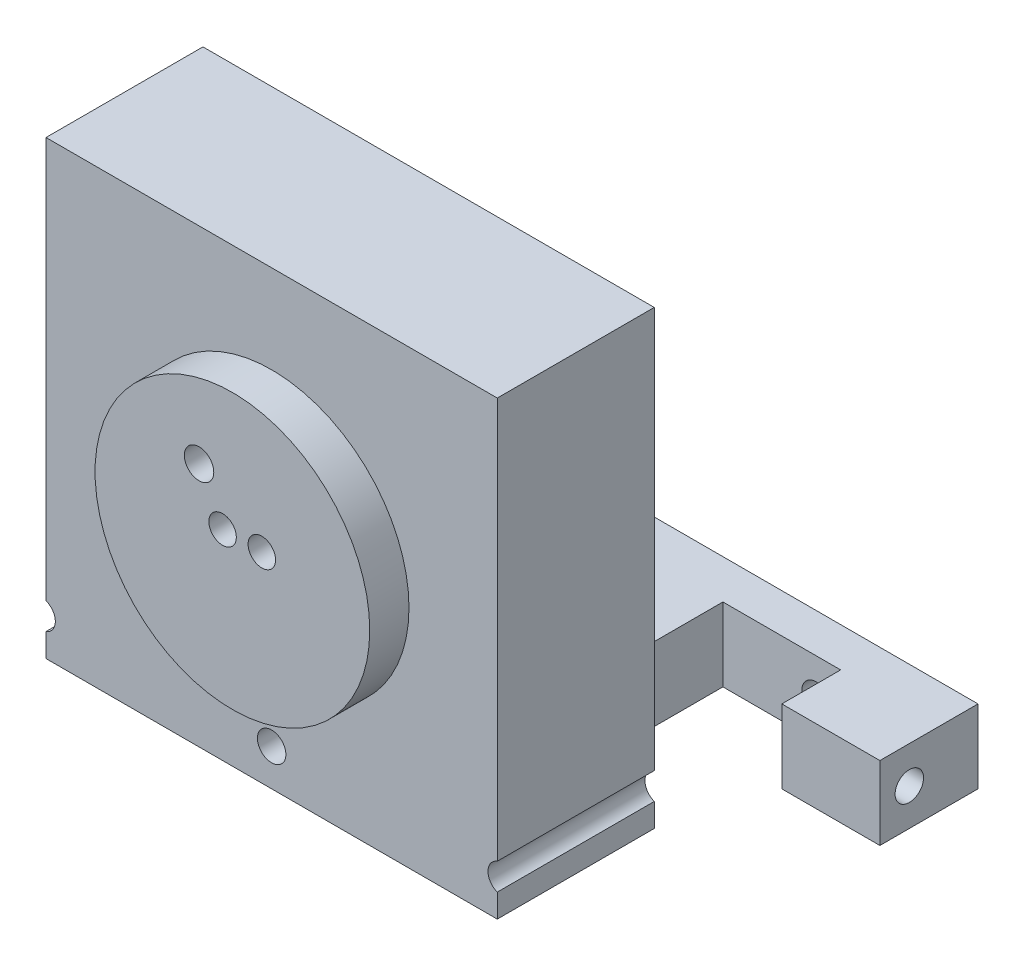
ISO-10303-21;
HEADER;
FILE_DESCRIPTION(('STEP AP214'),'2;1');
FILE_NAME('part.step','',(''),(''),'','','');
FILE_SCHEMA(('AUTOMOTIVE_DESIGN { 1 0 10303 214 1 1 1 1 }'));
ENDSEC;
DATA;
#1=APPLICATION_CONTEXT('core data for automotive mechanical design processes');
#2=APPLICATION_PROTOCOL_DEFINITION('international standard','automotive_design',2000,#1);
#3=PRODUCT_CONTEXT('',#1,'mechanical');
#4=PRODUCT('Part','Part','',(#3));
#5=PRODUCT_RELATED_PRODUCT_CATEGORY('part','',(#4));
#6=PRODUCT_DEFINITION_FORMATION('','',#4);
#7=PRODUCT_DEFINITION_CONTEXT('part definition',#1,'design');
#8=PRODUCT_DEFINITION('design','',#6,#7);
#9=PRODUCT_DEFINITION_SHAPE('','',#8);
#10=(LENGTH_UNIT() NAMED_UNIT(*) SI_UNIT(.MILLI.,.METRE.));
#11=(NAMED_UNIT(*) PLANE_ANGLE_UNIT() SI_UNIT($,.RADIAN.));
#12=(NAMED_UNIT(*) SI_UNIT($,.STERADIAN.) SOLID_ANGLE_UNIT());
#13=UNCERTAINTY_MEASURE_WITH_UNIT(LENGTH_MEASURE(1.E-05),#10,'distance_accuracy_value','');
#14=(GEOMETRIC_REPRESENTATION_CONTEXT(3) GLOBAL_UNCERTAINTY_ASSIGNED_CONTEXT((#13)) GLOBAL_UNIT_ASSIGNED_CONTEXT((#10,
#11,#12)) REPRESENTATION_CONTEXT('',''));
#15=CARTESIAN_POINT('',(0.,0.,0.));
#16=DIRECTION('',(0.,0.,1.));
#17=DIRECTION('',(1.,0.,0.));
#18=AXIS2_PLACEMENT_3D('',#15,#16,#17);
#19=CARTESIAN_POINT('',(11.5,0.,8.));
#20=DIRECTION('',(1.,0.,0.));
#21=DIRECTION('',(0.,0.,-1.));
#22=AXIS2_PLACEMENT_3D('',#19,#20,#21);
#23=PLANE('',#22);
#24=DIRECTION('',(0.,0.,-1.));
#25=VECTOR('',#24,1.);
#26=CARTESIAN_POINT('',(11.5,-10.3055328794408,10.050609665441));
#27=LINE('',#26,#25);
#28=CARTESIAN_POINT('',(11.5,-10.3055328794408,8.));
#29=VERTEX_POINT('',#28);
#30=CARTESIAN_POINT('',(11.5,-10.3055328794408,0.));
#31=VERTEX_POINT('',#30);
#32=EDGE_CURVE('E265',#29,#31,#27,.T.);
#33=ORIENTED_EDGE('',*,*,#32,.F.);
#34=DIRECTION('',(0.,-1.,0.));
#35=VECTOR('',#34,1.);
#36=CARTESIAN_POINT('',(11.5,0.,8.));
#37=LINE('',#36,#35);
#38=CARTESIAN_POINT('',(11.5,-11.5,8.));
#39=VERTEX_POINT('',#38);
#40=EDGE_CURVE('E322',#29,#39,#37,.T.);
#41=ORIENTED_EDGE('',*,*,#40,.T.);
#42=DIRECTION('',(0.,0.,-1.));
#43=VECTOR('',#42,1.);
#44=CARTESIAN_POINT('',(11.5,-11.5,8.));
#45=LINE('',#44,#43);
#46=CARTESIAN_POINT('',(11.5,-11.5,0.));
#47=VERTEX_POINT('',#46);
#48=EDGE_CURVE('E332',#39,#47,#45,.T.);
#49=ORIENTED_EDGE('',*,*,#48,.T.);
#50=DIRECTION('',(0.,-1.,0.));
#51=VECTOR('',#50,1.);
#52=CARTESIAN_POINT('',(11.5,0.,0.));
#53=LINE('',#52,#51);
#54=EDGE_CURVE('E335',#31,#47,#53,.T.);
#55=ORIENTED_EDGE('',*,*,#54,.F.);
#56=EDGE_LOOP('',(#33,#41,#49,#55));
#57=FACE_BOUND('',#56,.T.);
#58=ADVANCED_FACE('F35',(#57),#23,.T.);
#59=CARTESIAN_POINT('',(-11.5,0.,8.));
#60=DIRECTION('',(-1.,0.,0.));
#61=DIRECTION('',(0.,-1.,0.));
#62=AXIS2_PLACEMENT_3D('',#59,#60,#61);
#63=PLANE('',#62);
#64=DIRECTION('',(0.,0.,-1.));
#65=VECTOR('',#64,1.);
#66=CARTESIAN_POINT('',(-11.5,-8.94446712055919,10.050609665441));
#67=LINE('',#66,#65);
#68=CARTESIAN_POINT('',(-11.5,-8.94446712055919,8.));
#69=VERTEX_POINT('',#68);
#70=CARTESIAN_POINT('',(-11.5,-8.94446712055919,0.));
#71=VERTEX_POINT('',#70);
#72=EDGE_CURVE('E274',#69,#71,#67,.T.);
#73=ORIENTED_EDGE('',*,*,#72,.F.);
#74=DIRECTION('',(0.,1.,0.));
#75=VECTOR('',#74,1.);
#76=CARTESIAN_POINT('',(-11.5,0.,8.));
#77=LINE('',#76,#75);
#78=CARTESIAN_POINT('',(-11.5,11.5,8.));
#79=VERTEX_POINT('',#78);
#80=EDGE_CURVE('E325',#69,#79,#77,.T.);
#81=ORIENTED_EDGE('',*,*,#80,.T.);
#82=DIRECTION('',(0.,0.,-1.));
#83=VECTOR('',#82,1.);
#84=CARTESIAN_POINT('',(-11.5,11.5,8.));
#85=LINE('',#84,#83);
#86=CARTESIAN_POINT('',(-11.5,11.5,0.));
#87=VERTEX_POINT('',#86);
#88=EDGE_CURVE('E44',#79,#87,#85,.T.);
#89=ORIENTED_EDGE('',*,*,#88,.T.);
#90=DIRECTION('',(0.,1.,0.));
#91=VECTOR('',#90,1.);
#92=CARTESIAN_POINT('',(-11.5,0.,0.));
#93=LINE('',#92,#91);
#94=EDGE_CURVE('E342',#71,#87,#93,.T.);
#95=ORIENTED_EDGE('',*,*,#94,.F.);
#96=EDGE_LOOP('',(#73,#81,#89,#95));
#97=FACE_BOUND('',#96,.T.);
#98=ADVANCED_FACE('F359',(#97),#63,.T.);
#99=CARTESIAN_POINT('',(0.,0.,0.));
#100=DIRECTION('',(0.,0.,1.));
#101=DIRECTION('',(1.,0.,0.));
#102=AXIS2_PLACEMENT_3D('',#99,#100,#101);
#103=PLANE('',#102);
#104=CARTESIAN_POINT('',(0.,0.,0.));
#105=DIRECTION('',(0.,0.,1.));
#106=DIRECTION('',(1.,0.,0.));
#107=AXIS2_PLACEMENT_3D('',#104,#105,#106);
#108=CIRCLE('',#107,6.5);
#109=CARTESIAN_POINT('',(6.5,0.,0.));
#110=VERTEX_POINT('',#109);
#111=EDGE_CURVE('E317',#110,#110,#108,.T.);
#112=ORIENTED_EDGE('',*,*,#111,.T.);
#113=EDGE_LOOP('',(#112));
#114=FACE_BOUND('',#113,.T.);
#115=CARTESIAN_POINT('',(11.5,11.5,0.));
#116=VERTEX_POINT('',#115);
#117=CARTESIAN_POINT('',(11.5,-8.94446712055919,0.));
#118=VERTEX_POINT('',#117);
#119=EDGE_CURVE('E336',#116,#118,#53,.T.);
#120=ORIENTED_EDGE('',*,*,#119,.T.);
#121=CARTESIAN_POINT('',(11.75,-9.625,0.));
#122=DIRECTION('',(0.,0.,1.));
#123=DIRECTION('',(1.,0.,0.));
#124=AXIS2_PLACEMENT_3D('',#121,#122,#123);
#125=CIRCLE('',#124,0.725);
#126=EDGE_CURVE('E262',#118,#31,#125,.T.);
#127=ORIENTED_EDGE('',*,*,#126,.T.);
#128=ORIENTED_EDGE('',*,*,#54,.T.);
#129=DIRECTION('',(1.,0.,0.));
#130=VECTOR('',#129,1.);
#131=CARTESIAN_POINT('',(0.,-11.5,0.));
#132=LINE('',#131,#130);
#133=CARTESIAN_POINT('',(7.,-11.5,0.));
#134=VERTEX_POINT('',#133);
#135=EDGE_CURVE('E346',#134,#47,#132,.T.);
#136=ORIENTED_EDGE('',*,*,#135,.F.);
#137=DIRECTION('',(0.,-1.,0.));
#138=VECTOR('',#137,1.);
#139=CARTESIAN_POINT('',(7.,-11.5,0.));
#140=LINE('',#139,#138);
#141=CARTESIAN_POINT('',(7.,-7.75,0.));
#142=VERTEX_POINT('',#141);
#143=EDGE_CURVE('E295',#142,#134,#140,.T.);
#144=ORIENTED_EDGE('',*,*,#143,.F.);
#145=DIRECTION('',(1.,0.,0.));
#146=VECTOR('',#145,1.);
#147=CARTESIAN_POINT('',(0.,-7.75,0.));
#148=LINE('',#147,#146);
#149=CARTESIAN_POINT('',(-7.,-7.75,0.));
#150=VERTEX_POINT('',#149);
#151=EDGE_CURVE('E301',#150,#142,#148,.T.);
#152=ORIENTED_EDGE('',*,*,#151,.F.);
#153=DIRECTION('',(0.,1.,0.));
#154=VECTOR('',#153,1.);
#155=CARTESIAN_POINT('',(-7.,-11.5,0.));
#156=LINE('',#155,#154);
#157=CARTESIAN_POINT('',(-7.,-11.5,0.));
#158=VERTEX_POINT('',#157);
#159=EDGE_CURVE('E182',#158,#150,#156,.T.);
#160=ORIENTED_EDGE('',*,*,#159,.F.);
#161=CARTESIAN_POINT('',(-11.5,-11.5,0.));
#162=VERTEX_POINT('',#161);
#163=EDGE_CURVE('E347',#162,#158,#132,.T.);
#164=ORIENTED_EDGE('',*,*,#163,.F.);
#165=CARTESIAN_POINT('',(-11.5,-10.3055328794408,0.));
#166=VERTEX_POINT('',#165);
#167=EDGE_CURVE('E343',#162,#166,#93,.T.);
#168=ORIENTED_EDGE('',*,*,#167,.T.);
#169=CARTESIAN_POINT('',(-11.75,-9.625,0.));
#170=DIRECTION('',(0.,0.,1.));
#171=DIRECTION('',(1.,0.,0.));
#172=AXIS2_PLACEMENT_3D('',#169,#170,#171);
#173=CIRCLE('',#172,0.725);
#174=EDGE_CURVE('E271',#166,#71,#173,.T.);
#175=ORIENTED_EDGE('',*,*,#174,.T.);
#176=ORIENTED_EDGE('',*,*,#94,.T.);
#177=DIRECTION('',(1.,0.,0.));
#178=VECTOR('',#177,1.);
#179=CARTESIAN_POINT('',(0.,11.5,0.));
#180=LINE('',#179,#178);
#181=EDGE_CURVE('E339',#87,#116,#180,.T.);
#182=ORIENTED_EDGE('',*,*,#181,.T.);
#183=EDGE_LOOP('',(#120,#127,#128,#136,#144,#152,#160,#164,#168,#175,#176,#182));
#184=FACE_BOUND('',#183,.T.);
#185=ADVANCED_FACE('F366',(#114,#184),#103,.F.);
#186=DIRECTION('',(0.,0.,-1.));
#187=VECTOR('',#186,1.);
#188=CARTESIAN_POINT('',(11.5,-8.94446712055919,10.050609665441));
#189=LINE('',#188,#187);
#190=CARTESIAN_POINT('',(11.5,-8.94446712055919,8.));
#191=VERTEX_POINT('',#190);
#192=EDGE_CURVE('E59',#118,#191,#189,.F.);
#193=ORIENTED_EDGE('',*,*,#192,.F.);
#194=ORIENTED_EDGE('',*,*,#119,.F.);
#195=DIRECTION('',(0.,0.,-1.));
#196=VECTOR('',#195,1.);
#197=CARTESIAN_POINT('',(11.5,11.5,8.));
#198=LINE('',#197,#196);
#199=CARTESIAN_POINT('',(11.5,11.5,8.));
#200=VERTEX_POINT('',#199);
#201=EDGE_CURVE('E11',#200,#116,#198,.T.);
#202=ORIENTED_EDGE('',*,*,#201,.F.);
#203=EDGE_CURVE('E318',#200,#191,#37,.T.);
#204=ORIENTED_EDGE('',*,*,#203,.T.);
#205=EDGE_LOOP('',(#193,#194,#202,#204));
#206=FACE_BOUND('',#205,.T.);
#207=ADVANCED_FACE('F381',(#206),#23,.T.);
#208=CARTESIAN_POINT('',(0.,11.5,8.));
#209=DIRECTION('',(0.,1.,0.));
#210=DIRECTION('',(0.,0.,1.));
#211=AXIS2_PLACEMENT_3D('',#208,#209,#210);
#212=PLANE('',#211);
#213=ORIENTED_EDGE('',*,*,#181,.F.);
#214=ORIENTED_EDGE('',*,*,#88,.F.);
#215=DIRECTION('',(1.,0.,0.));
#216=VECTOR('',#215,1.);
#217=CARTESIAN_POINT('',(0.,11.5,8.));
#218=LINE('',#217,#216);
#219=EDGE_CURVE('E321',#79,#200,#218,.T.);
#220=ORIENTED_EDGE('',*,*,#219,.T.);
#221=ORIENTED_EDGE('',*,*,#201,.T.);
#222=EDGE_LOOP('',(#213,#214,#220,#221));
#223=FACE_BOUND('',#222,.T.);
#224=ADVANCED_FACE('F363',(#223),#212,.T.);
#225=DIRECTION('',(0.,0.,-1.));
#226=VECTOR('',#225,1.);
#227=CARTESIAN_POINT('',(-11.5,-10.3055328794408,10.050609665441));
#228=LINE('',#227,#226);
#229=CARTESIAN_POINT('',(-11.5,-10.3055328794408,8.));
#230=VERTEX_POINT('',#229);
#231=EDGE_CURVE('E51',#166,#230,#228,.F.);
#232=ORIENTED_EDGE('',*,*,#231,.F.);
#233=ORIENTED_EDGE('',*,*,#167,.F.);
#234=DIRECTION('',(0.,0.,-1.));
#235=VECTOR('',#234,1.);
#236=CARTESIAN_POINT('',(-11.5,-11.5,8.));
#237=LINE('',#236,#235);
#238=CARTESIAN_POINT('',(-11.5,-11.5,8.));
#239=VERTEX_POINT('',#238);
#240=EDGE_CURVE('E351',#239,#162,#237,.T.);
#241=ORIENTED_EDGE('',*,*,#240,.F.);
#242=EDGE_CURVE('E326',#239,#230,#77,.T.);
#243=ORIENTED_EDGE('',*,*,#242,.T.);
#244=EDGE_LOOP('',(#232,#233,#241,#243));
#245=FACE_BOUND('',#244,.T.);
#246=ADVANCED_FACE('F371',(#245),#63,.T.);
#247=CARTESIAN_POINT('',(0.,0.,8.));
#248=DIRECTION('',(0.,0.,-1.));
#249=DIRECTION('',(-1.,0.,0.));
#250=AXIS2_PLACEMENT_3D('',#247,#248,#249);
#251=CYLINDRICAL_SURFACE('',#250,6.5);
#252=CARTESIAN_POINT('',(0.,0.,8.));
#253=DIRECTION('',(0.,0.,1.));
#254=DIRECTION('',(1.,0.,0.));
#255=AXIS2_PLACEMENT_3D('',#252,#253,#254);
#256=CIRCLE('',#255,6.5);
#257=CARTESIAN_POINT('',(6.5,0.,8.));
#258=VERTEX_POINT('',#257);
#259=EDGE_CURVE('E490',#258,#258,#256,.T.);
#260=ORIENTED_EDGE('',*,*,#259,.T.);
#261=EDGE_LOOP('',(#260));
#262=FACE_BOUND('',#261,.T.);
#263=ORIENTED_EDGE('',*,*,#111,.F.);
#264=EDGE_LOOP('',(#263));
#265=FACE_BOUND('',#264,.T.);
#266=ADVANCED_FACE('F37',(#262,#265),#251,.F.);
#267=CARTESIAN_POINT('',(0.,-11.5,8.));
#268=DIRECTION('',(0.,1.,0.));
#269=DIRECTION('',(0.,0.,1.));
#270=AXIS2_PLACEMENT_3D('',#267,#268,#269);
#271=PLANE('',#270);
#272=ORIENTED_EDGE('',*,*,#163,.T.);
#273=DIRECTION('',(0.,0.,1.));
#274=VECTOR('',#273,1.);
#275=CARTESIAN_POINT('',(-7.,-11.5,-8.));
#276=LINE('',#275,#274);
#277=CARTESIAN_POINT('',(-7.,-11.5,-8.));
#278=VERTEX_POINT('',#277);
#279=EDGE_CURVE('E314',#278,#158,#276,.T.);
#280=ORIENTED_EDGE('',*,*,#279,.F.);
#281=DIRECTION('',(-1.,0.,0.));
#282=VECTOR('',#281,1.);
#283=CARTESIAN_POINT('',(0.0540115117305829,-11.5,-8.));
#284=LINE('',#283,#282);
#285=CARTESIAN_POINT('',(-13.,-11.5,-8.));
#286=VERTEX_POINT('',#285);
#287=EDGE_CURVE('E285',#278,#286,#284,.T.);
#288=ORIENTED_EDGE('',*,*,#287,.T.);
#289=DIRECTION('',(0.,0.,1.));
#290=VECTOR('',#289,1.);
#291=CARTESIAN_POINT('',(-13.,-11.5,-10.));
#292=LINE('',#291,#290);
#293=CARTESIAN_POINT('',(-13.,-11.5,-5.));
#294=VERTEX_POINT('',#293);
#295=EDGE_CURVE('E212',#286,#294,#292,.T.);
#296=ORIENTED_EDGE('',*,*,#295,.T.);
#297=DIRECTION('',(1.,0.,0.));
#298=VECTOR('',#297,1.);
#299=CARTESIAN_POINT('',(-18.,-11.5,-5.));
#300=LINE('',#299,#298);
#301=CARTESIAN_POINT('',(-18.,-11.5,-5.));
#302=VERTEX_POINT('',#301);
#303=EDGE_CURVE('E190',#302,#294,#300,.T.);
#304=ORIENTED_EDGE('',*,*,#303,.F.);
#305=DIRECTION('',(0.,0.,1.));
#306=VECTOR('',#305,1.);
#307=CARTESIAN_POINT('',(-18.,-11.5,-10.));
#308=LINE('',#307,#306);
#309=CARTESIAN_POINT('',(-18.,-11.5,-10.));
#310=VERTEX_POINT('',#309);
#311=EDGE_CURVE('E186',#310,#302,#308,.T.);
#312=ORIENTED_EDGE('',*,*,#311,.F.);
#313=DIRECTION('',(-1.,0.,0.));
#314=VECTOR('',#313,1.);
#315=CARTESIAN_POINT('',(0.0540115117305829,-11.5,-10.));
#316=LINE('',#315,#314);
#317=CARTESIAN_POINT('',(18.,-11.5,-10.));
#318=VERTEX_POINT('',#317);
#319=EDGE_CURVE('E172',#318,#310,#316,.T.);
#320=ORIENTED_EDGE('',*,*,#319,.F.);
#321=DIRECTION('',(0.,0.,-1.));
#322=VECTOR('',#321,1.);
#323=CARTESIAN_POINT('',(18.,-11.5,-10.));
#324=LINE('',#323,#322);
#325=CARTESIAN_POINT('',(18.,-11.5,-5.));
#326=VERTEX_POINT('',#325);
#327=EDGE_CURVE('E232',#326,#318,#324,.T.);
#328=ORIENTED_EDGE('',*,*,#327,.F.);
#329=DIRECTION('',(-1.,0.,0.));
#330=VECTOR('',#329,1.);
#331=CARTESIAN_POINT('',(18.,-11.5,-5.));
#332=LINE('',#331,#330);
#333=CARTESIAN_POINT('',(13.,-11.5,-5.));
#334=VERTEX_POINT('',#333);
#335=EDGE_CURVE('E234',#326,#334,#332,.T.);
#336=ORIENTED_EDGE('',*,*,#335,.T.);
#337=DIRECTION('',(0.,0.,-1.));
#338=VECTOR('',#337,1.);
#339=CARTESIAN_POINT('',(13.,-11.5,-10.));
#340=LINE('',#339,#338);
#341=CARTESIAN_POINT('',(13.,-11.5,-8.));
#342=VERTEX_POINT('',#341);
#343=EDGE_CURVE('E228',#334,#342,#340,.T.);
#344=ORIENTED_EDGE('',*,*,#343,.T.);
#345=CARTESIAN_POINT('',(7.,-11.5,-8.));
#346=VERTEX_POINT('',#345);
#347=EDGE_CURVE('E286',#342,#346,#284,.T.);
#348=ORIENTED_EDGE('',*,*,#347,.T.);
#349=DIRECTION('',(0.,0.,1.));
#350=VECTOR('',#349,1.);
#351=CARTESIAN_POINT('',(7.,-11.5,-8.));
#352=LINE('',#351,#350);
#353=EDGE_CURVE('E298',#346,#134,#352,.T.);
#354=ORIENTED_EDGE('',*,*,#353,.T.);
#355=ORIENTED_EDGE('',*,*,#135,.T.);
#356=ORIENTED_EDGE('',*,*,#48,.F.);
#357=DIRECTION('',(1.,0.,0.));
#358=VECTOR('',#357,1.);
#359=CARTESIAN_POINT('',(0.,-11.5,8.));
#360=LINE('',#359,#358);
#361=EDGE_CURVE('E329',#239,#39,#360,.T.);
#362=ORIENTED_EDGE('',*,*,#361,.F.);
#363=ORIENTED_EDGE('',*,*,#240,.T.);
#364=EDGE_LOOP('',(#272,#280,#288,#296,#304,#312,#320,#328,#336,#344,#348,#354,#355,#356,#362,#363));
#365=FACE_BOUND('',#364,.T.);
#366=ADVANCED_FACE('F188',(#365),#271,.F.);
#367=CARTESIAN_POINT('',(0.,0.,8.));
#368=DIRECTION('',(0.,0.,1.));
#369=DIRECTION('',(1.,0.,0.));
#370=AXIS2_PLACEMENT_3D('',#367,#368,#369);
#371=PLANE('',#370);
#372=CARTESIAN_POINT('',(0.,0.,8.));
#373=DIRECTION('',(0.,0.,1.));
#374=DIRECTION('',(1.,0.,0.));
#375=AXIS2_PLACEMENT_3D('',#372,#373,#374);
#376=CIRCLE('',#375,7.);
#377=CARTESIAN_POINT('',(7.,0.,8.));
#378=VERTEX_POINT('',#377);
#379=EDGE_CURVE('E497',#378,#378,#376,.T.);
#380=ORIENTED_EDGE('',*,*,#379,.F.);
#381=EDGE_LOOP('',(#380));
#382=FACE_BOUND('',#381,.T.);
#383=CARTESIAN_POINT('',(11.75,-9.625,8.));
#384=DIRECTION('',(0.,0.,1.));
#385=DIRECTION('',(1.,0.,0.));
#386=AXIS2_PLACEMENT_3D('',#383,#384,#385);
#387=CIRCLE('',#386,0.725);
#388=EDGE_CURVE('E250',#29,#191,#387,.F.);
#389=ORIENTED_EDGE('',*,*,#388,.T.);
#390=ORIENTED_EDGE('',*,*,#203,.F.);
#391=ORIENTED_EDGE('',*,*,#219,.F.);
#392=ORIENTED_EDGE('',*,*,#80,.F.);
#393=CARTESIAN_POINT('',(-11.75,-9.625,8.));
#394=DIRECTION('',(0.,0.,1.));
#395=DIRECTION('',(1.,0.,0.));
#396=AXIS2_PLACEMENT_3D('',#393,#394,#395);
#397=CIRCLE('',#396,0.725);
#398=EDGE_CURVE('E249',#69,#230,#397,.F.);
#399=ORIENTED_EDGE('',*,*,#398,.T.);
#400=ORIENTED_EDGE('',*,*,#242,.F.);
#401=ORIENTED_EDGE('',*,*,#361,.T.);
#402=ORIENTED_EDGE('',*,*,#40,.F.);
#403=EDGE_LOOP('',(#389,#390,#391,#392,#399,#400,#401,#402));
#404=FACE_BOUND('',#403,.T.);
#405=CARTESIAN_POINT('',(0.,-9.625,8.));
#406=DIRECTION('',(0.,0.,1.));
#407=DIRECTION('',(1.,0.,0.));
#408=AXIS2_PLACEMENT_3D('',#405,#406,#407);
#409=CIRCLE('',#408,0.725);
#410=CARTESIAN_POINT('',(0.725000000000002,-9.625,8.));
#411=VERTEX_POINT('',#410);
#412=EDGE_CURVE('E258',#411,#411,#409,.F.);
#413=ORIENTED_EDGE('',*,*,#412,.T.);
#414=EDGE_LOOP('',(#413));
#415=FACE_BOUND('',#414,.T.);
#416=ADVANCED_FACE('F375',(#382,#404,#415),#371,.T.);
#417=CARTESIAN_POINT('',(-7.,-11.5,-8.));
#418=DIRECTION('',(1.,0.,0.));
#419=DIRECTION('',(0.,0.,-1.));
#420=AXIS2_PLACEMENT_3D('',#417,#418,#419);
#421=PLANE('',#420);
#422=ORIENTED_EDGE('',*,*,#159,.T.);
#423=DIRECTION('',(0.,0.,1.));
#424=VECTOR('',#423,1.);
#425=CARTESIAN_POINT('',(-7.,-7.75,-8.));
#426=LINE('',#425,#424);
#427=CARTESIAN_POINT('',(-7.,-7.75,-8.));
#428=VERTEX_POINT('',#427);
#429=EDGE_CURVE('E311',#428,#150,#426,.T.);
#430=ORIENTED_EDGE('',*,*,#429,.F.);
#431=DIRECTION('',(0.,1.,0.));
#432=VECTOR('',#431,1.);
#433=CARTESIAN_POINT('',(-7.,-11.5,-8.));
#434=LINE('',#433,#432);
#435=EDGE_CURVE('E291',#278,#428,#434,.T.);
#436=ORIENTED_EDGE('',*,*,#435,.F.);
#437=ORIENTED_EDGE('',*,*,#279,.T.);
#438=EDGE_LOOP('',(#422,#430,#436,#437));
#439=FACE_BOUND('',#438,.T.);
#440=ADVANCED_FACE('F412',(#439),#421,.F.);
#441=CARTESIAN_POINT('',(0.,-7.75,-8.));
#442=DIRECTION('',(0.,-1.,0.));
#443=DIRECTION('',(1.,0.,0.));
#444=AXIS2_PLACEMENT_3D('',#441,#442,#443);
#445=PLANE('',#444);
#446=ORIENTED_EDGE('',*,*,#151,.T.);
#447=DIRECTION('',(0.,0.,1.));
#448=VECTOR('',#447,1.);
#449=CARTESIAN_POINT('',(7.,-7.75,-8.));
#450=LINE('',#449,#448);
#451=CARTESIAN_POINT('',(7.,-7.75,-8.));
#452=VERTEX_POINT('',#451);
#453=EDGE_CURVE('E308',#452,#142,#450,.T.);
#454=ORIENTED_EDGE('',*,*,#453,.F.);
#455=DIRECTION('',(1.,0.,0.));
#456=VECTOR('',#455,1.);
#457=CARTESIAN_POINT('',(0.,-7.75,-8.));
#458=LINE('',#457,#456);
#459=CARTESIAN_POINT('',(13.,-7.75,-8.));
#460=VERTEX_POINT('',#459);
#461=EDGE_CURVE('E276',#452,#460,#458,.T.);
#462=ORIENTED_EDGE('',*,*,#461,.T.);
#463=DIRECTION('',(0.,0.,1.));
#464=VECTOR('',#463,1.);
#465=CARTESIAN_POINT('',(13.,-7.74999999999999,-10.));
#466=LINE('',#465,#464);
#467=CARTESIAN_POINT('',(13.,-7.74999999999999,-5.));
#468=VERTEX_POINT('',#467);
#469=EDGE_CURVE('E223',#460,#468,#466,.T.);
#470=ORIENTED_EDGE('',*,*,#469,.T.);
#471=DIRECTION('',(-1.,0.,0.));
#472=VECTOR('',#471,1.);
#473=CARTESIAN_POINT('',(18.,-7.75,-5.));
#474=LINE('',#473,#472);
#475=CARTESIAN_POINT('',(18.,-7.75,-5.));
#476=VERTEX_POINT('',#475);
#477=EDGE_CURVE('E242',#476,#468,#474,.T.);
#478=ORIENTED_EDGE('',*,*,#477,.F.);
#479=DIRECTION('',(0.,0.,1.));
#480=VECTOR('',#479,1.);
#481=CARTESIAN_POINT('',(18.,-7.74999999999999,-10.));
#482=LINE('',#481,#480);
#483=CARTESIAN_POINT('',(18.,-7.74999999999999,-10.));
#484=VERTEX_POINT('',#483);
#485=EDGE_CURVE('E227',#484,#476,#482,.T.);
#486=ORIENTED_EDGE('',*,*,#485,.F.);
#487=DIRECTION('',(1.,0.,0.));
#488=VECTOR('',#487,1.);
#489=CARTESIAN_POINT('',(0.,-7.75,-10.));
#490=LINE('',#489,#488);
#491=CARTESIAN_POINT('',(-18.,-7.74999999999999,-10.));
#492=VERTEX_POINT('',#491);
#493=EDGE_CURVE('E183',#492,#484,#490,.T.);
#494=ORIENTED_EDGE('',*,*,#493,.F.);
#495=DIRECTION('',(0.,0.,-1.));
#496=VECTOR('',#495,1.);
#497=CARTESIAN_POINT('',(-18.,-7.74999999999999,-10.));
#498=LINE('',#497,#496);
#499=CARTESIAN_POINT('',(-18.,-7.74999999999999,-5.));
#500=VERTEX_POINT('',#499);
#501=EDGE_CURVE('E199',#500,#492,#498,.T.);
#502=ORIENTED_EDGE('',*,*,#501,.F.);
#503=DIRECTION('',(1.,0.,0.));
#504=VECTOR('',#503,1.);
#505=CARTESIAN_POINT('',(-18.,-7.74999999999999,-5.));
#506=LINE('',#505,#504);
#507=CARTESIAN_POINT('',(-13.,-7.74999999999999,-5.));
#508=VERTEX_POINT('',#507);
#509=EDGE_CURVE('E211',#500,#508,#506,.T.);
#510=ORIENTED_EDGE('',*,*,#509,.T.);
#511=DIRECTION('',(0.,0.,-1.));
#512=VECTOR('',#511,1.);
#513=CARTESIAN_POINT('',(-13.,-7.74999999999999,-10.));
#514=LINE('',#513,#512);
#515=CARTESIAN_POINT('',(-13.,-7.74999999999999,-8.));
#516=VERTEX_POINT('',#515);
#517=EDGE_CURVE('E200',#508,#516,#514,.T.);
#518=ORIENTED_EDGE('',*,*,#517,.T.);
#519=EDGE_CURVE('E279',#516,#428,#458,.T.);
#520=ORIENTED_EDGE('',*,*,#519,.T.);
#521=ORIENTED_EDGE('',*,*,#429,.T.);
#522=EDGE_LOOP('',(#446,#454,#462,#470,#478,#486,#494,#502,#510,#518,#520,#521));
#523=FACE_BOUND('',#522,.T.);
#524=ADVANCED_FACE('F409',(#523),#445,.F.);
#525=CARTESIAN_POINT('',(7.,-11.5,-8.));
#526=DIRECTION('',(-1.,0.,0.));
#527=DIRECTION('',(0.,0.,1.));
#528=AXIS2_PLACEMENT_3D('',#525,#526,#527);
#529=PLANE('',#528);
#530=ORIENTED_EDGE('',*,*,#143,.T.);
#531=ORIENTED_EDGE('',*,*,#353,.F.);
#532=DIRECTION('',(0.,-1.,0.));
#533=VECTOR('',#532,1.);
#534=CARTESIAN_POINT('',(7.,-11.5,-8.));
#535=LINE('',#534,#533);
#536=EDGE_CURVE('E294',#452,#346,#535,.T.);
#537=ORIENTED_EDGE('',*,*,#536,.F.);
#538=ORIENTED_EDGE('',*,*,#453,.T.);
#539=EDGE_LOOP('',(#530,#531,#537,#538));
#540=FACE_BOUND('',#539,.T.);
#541=ADVANCED_FACE('F402',(#540),#529,.F.);
#542=CARTESIAN_POINT('',(0.,0.,-8.));
#543=DIRECTION('',(0.,0.,1.));
#544=DIRECTION('',(1.,0.,0.));
#545=AXIS2_PLACEMENT_3D('',#542,#543,#544);
#546=PLANE('',#545);
#547=CARTESIAN_POINT('',(-11.75,-9.625,-8.));
#548=DIRECTION('',(0.,0.,1.));
#549=DIRECTION('',(1.,0.,0.));
#550=AXIS2_PLACEMENT_3D('',#547,#548,#549);
#551=CIRCLE('',#550,0.725);
#552=CARTESIAN_POINT('',(-11.025,-9.625,-8.));
#553=VERTEX_POINT('',#552);
#554=EDGE_CURVE('E267',#553,#553,#551,.T.);
#555=ORIENTED_EDGE('',*,*,#554,.F.);
#556=EDGE_LOOP('',(#555));
#557=FACE_BOUND('',#556,.T.);
#558=ORIENTED_EDGE('',*,*,#287,.F.);
#559=ORIENTED_EDGE('',*,*,#435,.T.);
#560=ORIENTED_EDGE('',*,*,#519,.F.);
#561=DIRECTION('',(0.,1.,0.));
#562=VECTOR('',#561,1.);
#563=CARTESIAN_POINT('',(-13.,-7.75,-8.));
#564=LINE('',#563,#562);
#565=EDGE_CURVE('E277',#286,#516,#564,.T.);
#566=ORIENTED_EDGE('',*,*,#565,.F.);
#567=EDGE_LOOP('',(#558,#559,#560,#566));
#568=FACE_BOUND('',#567,.T.);
#569=ADVANCED_FACE('F417',(#557,#568),#546,.T.);
#570=CARTESIAN_POINT('',(0.,0.,-10.));
#571=DIRECTION('',(0.,0.,1.));
#572=DIRECTION('',(1.,0.,0.));
#573=AXIS2_PLACEMENT_3D('',#570,#571,#572);
#574=PLANE('',#573);
#575=CARTESIAN_POINT('',(11.75,-9.625,-10.));
#576=DIRECTION('',(0.,0.,-1.));
#577=DIRECTION('',(-1.,0.,0.));
#578=AXIS2_PLACEMENT_3D('',#575,#576,#577);
#579=CIRCLE('',#578,0.725);
#580=CARTESIAN_POINT('',(11.025,-9.625,-10.));
#581=VERTEX_POINT('',#580);
#582=EDGE_CURVE('E245',#581,#581,#579,.T.);
#583=ORIENTED_EDGE('',*,*,#582,.F.);
#584=EDGE_LOOP('',(#583));
#585=FACE_BOUND('',#584,.T.);
#586=CARTESIAN_POINT('',(-11.75,-9.625,-10.));
#587=DIRECTION('',(0.,0.,-1.));
#588=DIRECTION('',(-1.,0.,0.));
#589=AXIS2_PLACEMENT_3D('',#586,#587,#588);
#590=CIRCLE('',#589,0.725);
#591=CARTESIAN_POINT('',(-12.475,-9.625,-10.));
#592=VERTEX_POINT('',#591);
#593=EDGE_CURVE('E246',#592,#592,#590,.T.);
#594=ORIENTED_EDGE('',*,*,#593,.F.);
#595=EDGE_LOOP('',(#594));
#596=FACE_BOUND('',#595,.T.);
#597=CARTESIAN_POINT('',(0.,-9.625,-10.));
#598=DIRECTION('',(0.,0.,-1.));
#599=DIRECTION('',(-1.,0.,0.));
#600=AXIS2_PLACEMENT_3D('',#597,#598,#599);
#601=CIRCLE('',#600,0.725);
#602=CARTESIAN_POINT('',(-0.724999999999998,-9.625,-10.));
#603=VERTEX_POINT('',#602);
#604=EDGE_CURVE('E252',#603,#603,#601,.T.);
#605=ORIENTED_EDGE('',*,*,#604,.F.);
#606=EDGE_LOOP('',(#605));
#607=FACE_BOUND('',#606,.T.);
#608=ORIENTED_EDGE('',*,*,#493,.T.);
#609=DIRECTION('',(0.,1.,0.));
#610=VECTOR('',#609,1.);
#611=CARTESIAN_POINT('',(18.,-7.74999999999999,-10.));
#612=LINE('',#611,#610);
#613=EDGE_CURVE('E178',#318,#484,#612,.T.);
#614=ORIENTED_EDGE('',*,*,#613,.F.);
#615=ORIENTED_EDGE('',*,*,#319,.T.);
#616=DIRECTION('',(0.,-1.,0.));
#617=VECTOR('',#616,1.);
#618=CARTESIAN_POINT('',(-18.,-11.5,-10.));
#619=LINE('',#618,#617);
#620=EDGE_CURVE('E176',#492,#310,#619,.T.);
#621=ORIENTED_EDGE('',*,*,#620,.F.);
#622=EDGE_LOOP('',(#608,#614,#615,#621));
#623=FACE_BOUND('',#622,.T.);
#624=ADVANCED_FACE('F174',(#585,#596,#607,#623),#574,.F.);
#625=CARTESIAN_POINT('',(11.75,-9.625,-8.));
#626=DIRECTION('',(0.,0.,1.));
#627=DIRECTION('',(1.,0.,0.));
#628=AXIS2_PLACEMENT_3D('',#625,#626,#627);
#629=CIRCLE('',#628,0.725);
#630=CARTESIAN_POINT('',(12.475,-9.625,-8.));
#631=VERTEX_POINT('',#630);
#632=EDGE_CURVE('E39',#631,#631,#629,.T.);
#633=ORIENTED_EDGE('',*,*,#632,.F.);
#634=EDGE_LOOP('',(#633));
#635=FACE_BOUND('',#634,.T.);
#636=ORIENTED_EDGE('',*,*,#461,.F.);
#637=ORIENTED_EDGE('',*,*,#536,.T.);
#638=ORIENTED_EDGE('',*,*,#347,.F.);
#639=DIRECTION('',(0.,-1.,0.));
#640=VECTOR('',#639,1.);
#641=CARTESIAN_POINT('',(13.,-7.75,-8.));
#642=LINE('',#641,#640);
#643=EDGE_CURVE('E282',#460,#342,#642,.T.);
#644=ORIENTED_EDGE('',*,*,#643,.F.);
#645=EDGE_LOOP('',(#636,#637,#638,#644));
#646=FACE_BOUND('',#645,.T.);
#647=ADVANCED_FACE('F405',(#635,#646),#546,.T.);
#648=CARTESIAN_POINT('',(11.75,-9.625,10.050609665441));
#649=DIRECTION('',(0.,0.,-1.));
#650=DIRECTION('',(-1.,0.,0.));
#651=AXIS2_PLACEMENT_3D('',#648,#649,#650);
#652=CYLINDRICAL_SURFACE('',#651,0.725);
#653=ORIENTED_EDGE('',*,*,#632,.T.);
#654=EDGE_LOOP('',(#653));
#655=FACE_BOUND('',#654,.T.);
#656=ORIENTED_EDGE('',*,*,#582,.T.);
#657=EDGE_LOOP('',(#656));
#658=FACE_BOUND('',#657,.T.);
#659=ADVANCED_FACE('F457',(#655,#658),#652,.F.);
#660=CARTESIAN_POINT('',(0.,-9.625,10.050609665441));
#661=DIRECTION('',(0.,0.,-1.));
#662=DIRECTION('',(-1.,0.,0.));
#663=AXIS2_PLACEMENT_3D('',#660,#661,#662);
#664=CYLINDRICAL_SURFACE('',#663,0.725);
#665=ORIENTED_EDGE('',*,*,#604,.T.);
#666=EDGE_LOOP('',(#665));
#667=FACE_BOUND('',#666,.T.);
#668=ORIENTED_EDGE('',*,*,#412,.F.);
#669=EDGE_LOOP('',(#668));
#670=FACE_BOUND('',#669,.T.);
#671=ADVANCED_FACE('F455',(#667,#670),#664,.F.);
#672=CARTESIAN_POINT('',(-11.75,-9.625,10.050609665441));
#673=DIRECTION('',(0.,0.,-1.));
#674=DIRECTION('',(-1.,0.,0.));
#675=AXIS2_PLACEMENT_3D('',#672,#673,#674);
#676=CYLINDRICAL_SURFACE('',#675,0.725);
#677=ORIENTED_EDGE('',*,*,#554,.T.);
#678=EDGE_LOOP('',(#677));
#679=FACE_BOUND('',#678,.T.);
#680=ORIENTED_EDGE('',*,*,#593,.T.);
#681=EDGE_LOOP('',(#680));
#682=FACE_BOUND('',#681,.T.);
#683=ADVANCED_FACE('F452',(#679,#682),#676,.F.);
#684=ORIENTED_EDGE('',*,*,#72,.T.);
#685=ORIENTED_EDGE('',*,*,#174,.F.);
#686=ORIENTED_EDGE('',*,*,#231,.T.);
#687=ORIENTED_EDGE('',*,*,#398,.F.);
#688=EDGE_LOOP('',(#684,#685,#686,#687));
#689=FACE_BOUND('',#688,.T.);
#690=ADVANCED_FACE('F369',(#689),#676,.F.);
#691=ORIENTED_EDGE('',*,*,#32,.T.);
#692=ORIENTED_EDGE('',*,*,#126,.F.);
#693=ORIENTED_EDGE('',*,*,#192,.T.);
#694=ORIENTED_EDGE('',*,*,#388,.F.);
#695=EDGE_LOOP('',(#691,#692,#693,#694));
#696=FACE_BOUND('',#695,.T.);
#697=ADVANCED_FACE('F398',(#696),#652,.F.);
#698=CARTESIAN_POINT('',(18.,0.,0.));
#699=DIRECTION('',(-1.,0.,0.));
#700=DIRECTION('',(0.,-1.,0.));
#701=AXIS2_PLACEMENT_3D('',#698,#699,#700);
#702=PLANE('',#701);
#703=ORIENTED_EDGE('',*,*,#613,.T.);
#704=ORIENTED_EDGE('',*,*,#485,.T.);
#705=DIRECTION('',(0.,-1.,0.));
#706=VECTOR('',#705,1.);
#707=CARTESIAN_POINT('',(18.,-7.75,-5.));
#708=LINE('',#707,#706);
#709=EDGE_CURVE('E230',#476,#326,#708,.T.);
#710=ORIENTED_EDGE('',*,*,#709,.T.);
#711=ORIENTED_EDGE('',*,*,#327,.T.);
#712=EDGE_LOOP('',(#703,#704,#710,#711));
#713=FACE_BOUND('',#712,.T.);
#714=CARTESIAN_POINT('',(18.,-9.625,-6.5));
#715=DIRECTION('',(1.,0.,0.));
#716=DIRECTION('',(0.,1.,0.));
#717=AXIS2_PLACEMENT_3D('',#714,#715,#716);
#718=CIRCLE('',#717,0.725000000000001);
#719=CARTESIAN_POINT('',(18.,-8.9,-6.5));
#720=VERTEX_POINT('',#719);
#721=EDGE_CURVE('E220',#720,#720,#718,.T.);
#722=ORIENTED_EDGE('',*,*,#721,.F.);
#723=EDGE_LOOP('',(#722));
#724=FACE_BOUND('',#723,.T.);
#725=ADVANCED_FACE('F430',(#713,#724),#702,.F.);
#726=CARTESIAN_POINT('',(13.,0.,0.));
#727=DIRECTION('',(-1.,0.,0.));
#728=DIRECTION('',(0.,-1.,0.));
#729=AXIS2_PLACEMENT_3D('',#726,#727,#728);
#730=PLANE('',#729);
#731=ORIENTED_EDGE('',*,*,#469,.F.);
#732=ORIENTED_EDGE('',*,*,#643,.T.);
#733=ORIENTED_EDGE('',*,*,#343,.F.);
#734=DIRECTION('',(0.,-1.,0.));
#735=VECTOR('',#734,1.);
#736=CARTESIAN_POINT('',(13.,-7.74999999999999,-5.));
#737=LINE('',#736,#735);
#738=EDGE_CURVE('E236',#468,#334,#737,.T.);
#739=ORIENTED_EDGE('',*,*,#738,.F.);
#740=EDGE_LOOP('',(#731,#732,#733,#739));
#741=FACE_BOUND('',#740,.T.);
#742=CARTESIAN_POINT('',(13.,-9.62499999999999,-6.5));
#743=DIRECTION('',(1.,0.,0.));
#744=DIRECTION('',(0.,1.,0.));
#745=AXIS2_PLACEMENT_3D('',#742,#743,#744);
#746=CIRCLE('',#745,0.725000000000001);
#747=CARTESIAN_POINT('',(13.,-8.9,-6.5));
#748=VERTEX_POINT('',#747);
#749=EDGE_CURVE('E219',#748,#748,#746,.T.);
#750=ORIENTED_EDGE('',*,*,#749,.T.);
#751=EDGE_LOOP('',(#750));
#752=FACE_BOUND('',#751,.T.);
#753=ADVANCED_FACE('F437',(#741,#752),#730,.T.);
#754=CARTESIAN_POINT('',(18.,-7.75,-5.));
#755=DIRECTION('',(0.,0.,-1.));
#756=DIRECTION('',(0.,1.,0.));
#757=AXIS2_PLACEMENT_3D('',#754,#755,#756);
#758=PLANE('',#757);
#759=ORIENTED_EDGE('',*,*,#738,.T.);
#760=ORIENTED_EDGE('',*,*,#335,.F.);
#761=ORIENTED_EDGE('',*,*,#709,.F.);
#762=ORIENTED_EDGE('',*,*,#477,.T.);
#763=EDGE_LOOP('',(#759,#760,#761,#762));
#764=FACE_BOUND('',#763,.T.);
#765=ADVANCED_FACE('F439',(#764),#758,.F.);
#766=CARTESIAN_POINT('',(18.,-9.625,-6.5));
#767=DIRECTION('',(-1.,0.,0.));
#768=DIRECTION('',(0.,-1.,0.));
#769=AXIS2_PLACEMENT_3D('',#766,#767,#768);
#770=CYLINDRICAL_SURFACE('',#769,0.725000000000001);
#771=ORIENTED_EDGE('',*,*,#721,.T.);
#772=EDGE_LOOP('',(#771));
#773=FACE_BOUND('',#772,.T.);
#774=ORIENTED_EDGE('',*,*,#749,.F.);
#775=EDGE_LOOP('',(#774));
#776=FACE_BOUND('',#775,.T.);
#777=ADVANCED_FACE('F441',(#773,#776),#770,.F.);
#778=CARTESIAN_POINT('',(-18.,0.,0.));
#779=DIRECTION('',(1.,0.,0.));
#780=DIRECTION('',(0.,0.,-1.));
#781=AXIS2_PLACEMENT_3D('',#778,#779,#780);
#782=PLANE('',#781);
#783=ORIENTED_EDGE('',*,*,#620,.T.);
#784=ORIENTED_EDGE('',*,*,#311,.T.);
#785=DIRECTION('',(0.,1.,0.));
#786=VECTOR('',#785,1.);
#787=CARTESIAN_POINT('',(-18.,-11.5,-5.));
#788=LINE('',#787,#786);
#789=EDGE_CURVE('E193',#302,#500,#788,.T.);
#790=ORIENTED_EDGE('',*,*,#789,.T.);
#791=ORIENTED_EDGE('',*,*,#501,.T.);
#792=EDGE_LOOP('',(#783,#784,#790,#791));
#793=FACE_BOUND('',#792,.T.);
#794=CARTESIAN_POINT('',(-18.,-9.62499999999999,-6.5));
#795=DIRECTION('',(-1.,0.,0.));
#796=DIRECTION('',(0.,0.,1.));
#797=AXIS2_PLACEMENT_3D('',#794,#795,#796);
#798=CIRCLE('',#797,0.725);
#799=CARTESIAN_POINT('',(-18.,-9.62499999999999,-5.775));
#800=VERTEX_POINT('',#799);
#801=EDGE_CURVE('E214',#800,#800,#798,.T.);
#802=ORIENTED_EDGE('',*,*,#801,.F.);
#803=EDGE_LOOP('',(#802));
#804=FACE_BOUND('',#803,.T.);
#805=ADVANCED_FACE('F196',(#793,#804),#782,.F.);
#806=CARTESIAN_POINT('',(-13.,0.,0.));
#807=DIRECTION('',(1.,0.,0.));
#808=DIRECTION('',(0.,0.,-1.));
#809=AXIS2_PLACEMENT_3D('',#806,#807,#808);
#810=PLANE('',#809);
#811=ORIENTED_EDGE('',*,*,#295,.F.);
#812=ORIENTED_EDGE('',*,*,#565,.T.);
#813=ORIENTED_EDGE('',*,*,#517,.F.);
#814=DIRECTION('',(0.,1.,0.));
#815=VECTOR('',#814,1.);
#816=CARTESIAN_POINT('',(-13.,-11.5,-5.));
#817=LINE('',#816,#815);
#818=EDGE_CURVE('E203',#294,#508,#817,.T.);
#819=ORIENTED_EDGE('',*,*,#818,.F.);
#820=EDGE_LOOP('',(#811,#812,#813,#819));
#821=FACE_BOUND('',#820,.T.);
#822=CARTESIAN_POINT('',(-13.,-9.62499999999999,-6.5));
#823=DIRECTION('',(-1.,0.,0.));
#824=DIRECTION('',(0.,0.,1.));
#825=AXIS2_PLACEMENT_3D('',#822,#823,#824);
#826=CIRCLE('',#825,0.725);
#827=CARTESIAN_POINT('',(-13.,-9.62499999999999,-5.775));
#828=VERTEX_POINT('',#827);
#829=EDGE_CURVE('E206',#828,#828,#826,.T.);
#830=ORIENTED_EDGE('',*,*,#829,.T.);
#831=EDGE_LOOP('',(#830));
#832=FACE_BOUND('',#831,.T.);
#833=ADVANCED_FACE('F422',(#821,#832),#810,.T.);
#834=CARTESIAN_POINT('',(-18.,-11.5,-5.));
#835=DIRECTION('',(0.,0.,-1.));
#836=DIRECTION('',(-1.,0.,0.));
#837=AXIS2_PLACEMENT_3D('',#834,#835,#836);
#838=PLANE('',#837);
#839=ORIENTED_EDGE('',*,*,#818,.T.);
#840=ORIENTED_EDGE('',*,*,#509,.F.);
#841=ORIENTED_EDGE('',*,*,#789,.F.);
#842=ORIENTED_EDGE('',*,*,#303,.T.);
#843=EDGE_LOOP('',(#839,#840,#841,#842));
#844=FACE_BOUND('',#843,.T.);
#845=ADVANCED_FACE('F425',(#844),#838,.F.);
#846=CARTESIAN_POINT('',(-18.,-9.62499999999999,-6.5));
#847=DIRECTION('',(1.,0.,0.));
#848=DIRECTION('',(0.,0.,-1.));
#849=AXIS2_PLACEMENT_3D('',#846,#847,#848);
#850=CYLINDRICAL_SURFACE('',#849,0.725);
#851=ORIENTED_EDGE('',*,*,#801,.T.);
#852=EDGE_LOOP('',(#851));
#853=FACE_BOUND('',#852,.T.);
#854=ORIENTED_EDGE('',*,*,#829,.F.);
#855=EDGE_LOOP('',(#854));
#856=FACE_BOUND('',#855,.T.);
#857=ADVANCED_FACE('F503',(#853,#856),#850,.F.);
#858=CARTESIAN_POINT('',(0.,0.,8.));
#859=DIRECTION('',(0.,0.,1.));
#860=DIRECTION('',(1.,0.,0.));
#861=AXIS2_PLACEMENT_3D('',#858,#859,#860);
#862=PLANE('',#861);
#863=CARTESIAN_POINT('',(-1.7,3.,8.));
#864=DIRECTION('',(0.,0.,1.));
#865=DIRECTION('',(1.,0.,0.));
#866=AXIS2_PLACEMENT_3D('',#863,#864,#865);
#867=CIRCLE('',#866,0.75);
#868=CARTESIAN_POINT('',(-0.95,3.,8.));
#869=VERTEX_POINT('',#868);
#870=EDGE_CURVE('E787',#869,#869,#867,.T.);
#871=ORIENTED_EDGE('',*,*,#870,.T.);
#872=EDGE_LOOP('',(#871));
#873=FACE_BOUND('',#872,.T.);
#874=CARTESIAN_POINT('',(-0.5,0.7,8.));
#875=DIRECTION('',(0.,0.,1.));
#876=DIRECTION('',(1.,0.,0.));
#877=AXIS2_PLACEMENT_3D('',#874,#875,#876);
#878=CIRCLE('',#877,0.7);
#879=CARTESIAN_POINT('',(0.2,0.7,8.));
#880=VERTEX_POINT('',#879);
#881=EDGE_CURVE('E789',#880,#880,#878,.T.);
#882=ORIENTED_EDGE('',*,*,#881,.T.);
#883=EDGE_LOOP('',(#882));
#884=FACE_BOUND('',#883,.T.);
#885=CARTESIAN_POINT('',(1.5,0.7,8.));
#886=DIRECTION('',(0.,0.,1.));
#887=DIRECTION('',(1.,0.,0.));
#888=AXIS2_PLACEMENT_3D('',#885,#886,#887);
#889=CIRCLE('',#888,0.7);
#890=CARTESIAN_POINT('',(2.2,0.7,8.));
#891=VERTEX_POINT('',#890);
#892=EDGE_CURVE('E795',#891,#891,#889,.T.);
#893=ORIENTED_EDGE('',*,*,#892,.T.);
#894=EDGE_LOOP('',(#893));
#895=FACE_BOUND('',#894,.T.);
#896=ORIENTED_EDGE('',*,*,#259,.F.);
#897=EDGE_LOOP('',(#896));
#898=FACE_BOUND('',#897,.T.);
#899=ADVANCED_FACE('F720',(#873,#884,#895,#898),#862,.F.);
#900=CARTESIAN_POINT('',(0.,0.,10.));
#901=DIRECTION('',(0.,0.,1.));
#902=DIRECTION('',(1.,0.,0.));
#903=AXIS2_PLACEMENT_3D('',#900,#901,#902);
#904=PLANE('',#903);
#905=CARTESIAN_POINT('',(-0.5,0.7,10.));
#906=DIRECTION('',(0.,0.,1.));
#907=DIRECTION('',(1.,0.,0.));
#908=AXIS2_PLACEMENT_3D('',#905,#906,#907);
#909=CIRCLE('',#908,0.7);
#910=CARTESIAN_POINT('',(0.2,0.7,10.));
#911=VERTEX_POINT('',#910);
#912=EDGE_CURVE('E792',#911,#911,#909,.T.);
#913=ORIENTED_EDGE('',*,*,#912,.F.);
#914=EDGE_LOOP('',(#913));
#915=FACE_BOUND('',#914,.T.);
#916=CARTESIAN_POINT('',(0.,0.,10.));
#917=DIRECTION('',(0.,0.,1.));
#918=DIRECTION('',(1.,0.,0.));
#919=AXIS2_PLACEMENT_3D('',#916,#917,#918);
#920=CIRCLE('',#919,7.);
#921=CARTESIAN_POINT('',(7.,0.,10.));
#922=VERTEX_POINT('',#921);
#923=EDGE_CURVE('E493',#922,#922,#920,.T.);
#924=ORIENTED_EDGE('',*,*,#923,.T.);
#925=EDGE_LOOP('',(#924));
#926=FACE_BOUND('',#925,.T.);
#927=CARTESIAN_POINT('',(1.5,0.7,10.));
#928=DIRECTION('',(0.,0.,1.));
#929=DIRECTION('',(1.,0.,0.));
#930=AXIS2_PLACEMENT_3D('',#927,#928,#929);
#931=CIRCLE('',#930,0.7);
#932=CARTESIAN_POINT('',(2.2,0.7,10.));
#933=VERTEX_POINT('',#932);
#934=EDGE_CURVE('E798',#933,#933,#931,.T.);
#935=ORIENTED_EDGE('',*,*,#934,.F.);
#936=EDGE_LOOP('',(#935));
#937=FACE_BOUND('',#936,.T.);
#938=CARTESIAN_POINT('',(-1.7,3.,10.));
#939=DIRECTION('',(0.,0.,1.));
#940=DIRECTION('',(1.,0.,0.));
#941=AXIS2_PLACEMENT_3D('',#938,#939,#940);
#942=CIRCLE('',#941,0.75);
#943=CARTESIAN_POINT('',(-0.95,3.,10.));
#944=VERTEX_POINT('',#943);
#945=EDGE_CURVE('E784',#944,#944,#942,.T.);
#946=ORIENTED_EDGE('',*,*,#945,.F.);
#947=EDGE_LOOP('',(#946));
#948=FACE_BOUND('',#947,.T.);
#949=ADVANCED_FACE('F726',(#915,#926,#937,#948),#904,.T.);
#950=CARTESIAN_POINT('',(0.,0.,10.));
#951=DIRECTION('',(0.,0.,-1.));
#952=DIRECTION('',(-1.,0.,0.));
#953=AXIS2_PLACEMENT_3D('',#950,#951,#952);
#954=CYLINDRICAL_SURFACE('',#953,7.);
#955=ORIENTED_EDGE('',*,*,#923,.F.);
#956=EDGE_LOOP('',(#955));
#957=FACE_BOUND('',#956,.T.);
#958=ORIENTED_EDGE('',*,*,#379,.T.);
#959=EDGE_LOOP('',(#958));
#960=FACE_BOUND('',#959,.T.);
#961=ADVANCED_FACE('F735',(#957,#960),#954,.T.);
#962=CARTESIAN_POINT('',(1.5,0.7,10.));
#963=DIRECTION('',(0.,0.,-1.));
#964=DIRECTION('',(-1.,0.,0.));
#965=AXIS2_PLACEMENT_3D('',#962,#963,#964);
#966=CYLINDRICAL_SURFACE('',#965,0.7);
#967=ORIENTED_EDGE('',*,*,#934,.T.);
#968=EDGE_LOOP('',(#967));
#969=FACE_BOUND('',#968,.T.);
#970=ORIENTED_EDGE('',*,*,#892,.F.);
#971=EDGE_LOOP('',(#970));
#972=FACE_BOUND('',#971,.T.);
#973=ADVANCED_FACE('F744',(#969,#972),#966,.F.);
#974=CARTESIAN_POINT('',(-0.5,0.7,10.));
#975=DIRECTION('',(0.,0.,-1.));
#976=DIRECTION('',(-1.,0.,0.));
#977=AXIS2_PLACEMENT_3D('',#974,#975,#976);
#978=CYLINDRICAL_SURFACE('',#977,0.7);
#979=ORIENTED_EDGE('',*,*,#912,.T.);
#980=EDGE_LOOP('',(#979));
#981=FACE_BOUND('',#980,.T.);
#982=ORIENTED_EDGE('',*,*,#881,.F.);
#983=EDGE_LOOP('',(#982));
#984=FACE_BOUND('',#983,.T.);
#985=ADVANCED_FACE('F752',(#981,#984),#978,.F.);
#986=CARTESIAN_POINT('',(-1.7,3.,10.));
#987=DIRECTION('',(0.,0.,-1.));
#988=DIRECTION('',(-1.,0.,0.));
#989=AXIS2_PLACEMENT_3D('',#986,#987,#988);
#990=CYLINDRICAL_SURFACE('',#989,0.75);
#991=ORIENTED_EDGE('',*,*,#945,.T.);
#992=EDGE_LOOP('',(#991));
#993=FACE_BOUND('',#992,.T.);
#994=ORIENTED_EDGE('',*,*,#870,.F.);
#995=EDGE_LOOP('',(#994));
#996=FACE_BOUND('',#995,.T.);
#997=ADVANCED_FACE('F761',(#993,#996),#990,.F.);
#998=CLOSED_SHELL('',(#58,#98,#185,#207,#224,#246,#266,#366,#416,#440,#524,#541,#569,#624,#647,
#659,#671,#683,#690,#697,#725,#753,#765,#777,#805,#833,#845,#857,#899,#949,#961,#973,#985,#997));
#999=MANIFOLD_SOLID_BREP('B2',#998);
#1000=ADVANCED_BREP_SHAPE_REPRESENTATION('',(#18,#999),#14);
#1001=SHAPE_DEFINITION_REPRESENTATION(#9,#1000);
ENDSEC;
END-ISO-10303-21;
